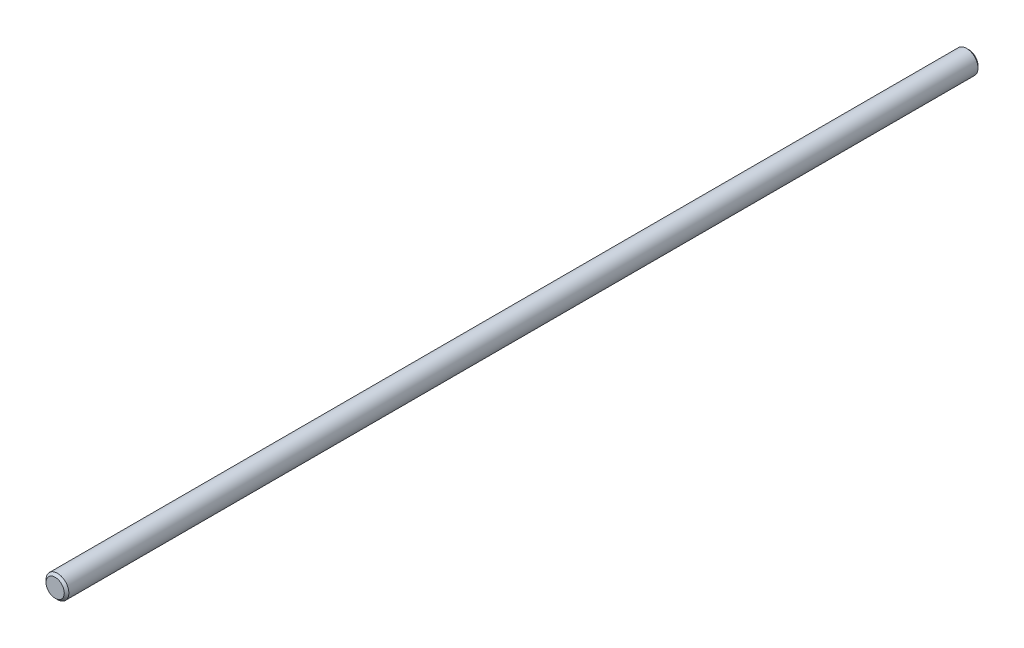
ISO-10303-21;
HEADER;
FILE_DESCRIPTION(('STEP AP214'),'2;1');
FILE_NAME('part.step','',(''),(''),'','','');
FILE_SCHEMA(('AUTOMOTIVE_DESIGN { 1 0 10303 214 1 1 1 1 }'));
ENDSEC;
DATA;
#1=APPLICATION_CONTEXT('core data for automotive mechanical design processes');
#2=APPLICATION_PROTOCOL_DEFINITION('international standard','automotive_design',2000,#1);
#3=PRODUCT_CONTEXT('',#1,'mechanical');
#4=PRODUCT('Part','Part','',(#3));
#5=PRODUCT_RELATED_PRODUCT_CATEGORY('part','',(#4));
#6=PRODUCT_DEFINITION_FORMATION('','',#4);
#7=PRODUCT_DEFINITION_CONTEXT('part definition',#1,'design');
#8=PRODUCT_DEFINITION('design','',#6,#7);
#9=PRODUCT_DEFINITION_SHAPE('','',#8);
#10=(LENGTH_UNIT() NAMED_UNIT(*) SI_UNIT(.MILLI.,.METRE.));
#11=(NAMED_UNIT(*) PLANE_ANGLE_UNIT() SI_UNIT($,.RADIAN.));
#12=(NAMED_UNIT(*) SI_UNIT($,.STERADIAN.) SOLID_ANGLE_UNIT());
#13=UNCERTAINTY_MEASURE_WITH_UNIT(LENGTH_MEASURE(1.E-05),#10,'distance_accuracy_value','');
#14=(GEOMETRIC_REPRESENTATION_CONTEXT(3) GLOBAL_UNCERTAINTY_ASSIGNED_CONTEXT((#13)) GLOBAL_UNIT_ASSIGNED_CONTEXT((#10,
#11,#12)) REPRESENTATION_CONTEXT('',''));
#15=CARTESIAN_POINT('',(0.,0.,0.));
#16=DIRECTION('',(0.,0.,1.));
#17=DIRECTION('',(1.,0.,0.));
#18=AXIS2_PLACEMENT_3D('',#15,#16,#17);
#19=CARTESIAN_POINT('',(0.,0.,190.5));
#20=DIRECTION('',(0.,0.,-1.));
#21=DIRECTION('',(-1.,0.,0.));
#22=AXIS2_PLACEMENT_3D('',#19,#20,#21);
#23=CYLINDRICAL_SURFACE('',#22,4.7625);
#24=CARTESIAN_POINT('',(0.,0.,-189.5475));
#25=DIRECTION('',(0.,0.,1.));
#26=DIRECTION('',(1.,0.,0.));
#27=AXIS2_PLACEMENT_3D('',#24,#25,#26);
#28=CIRCLE('',#27,4.7625);
#29=CARTESIAN_POINT('',(4.76249999999999,0.,-189.5475));
#30=VERTEX_POINT('',#29);
#31=EDGE_CURVE('E42',#30,#30,#28,.T.);
#32=ORIENTED_EDGE('',*,*,#31,.T.);
#33=EDGE_LOOP('',(#32));
#34=FACE_BOUND('',#33,.T.);
#35=CARTESIAN_POINT('',(0.,0.,189.5475));
#36=DIRECTION('',(0.,0.,1.));
#37=DIRECTION('',(1.,0.,0.));
#38=AXIS2_PLACEMENT_3D('',#35,#36,#37);
#39=CIRCLE('',#38,4.7625);
#40=CARTESIAN_POINT('',(4.7625,0.,189.5475));
#41=VERTEX_POINT('',#40);
#42=EDGE_CURVE('E46',#41,#41,#39,.F.);
#43=ORIENTED_EDGE('',*,*,#42,.T.);
#44=EDGE_LOOP('',(#43));
#45=FACE_BOUND('',#44,.T.);
#46=ADVANCED_FACE('F31',(#34,#45),#23,.T.);
#47=CARTESIAN_POINT('',(0.,0.,190.5));
#48=DIRECTION('',(0.,0.,1.));
#49=DIRECTION('',(1.,0.,0.));
#50=AXIS2_PLACEMENT_3D('',#47,#48,#49);
#51=PLANE('',#50);
#52=CARTESIAN_POINT('',(0.,0.,190.5));
#53=DIRECTION('',(0.,0.,1.));
#54=DIRECTION('',(1.,0.,0.));
#55=AXIS2_PLACEMENT_3D('',#52,#53,#54);
#56=CIRCLE('',#55,3.80999999999992);
#57=CARTESIAN_POINT('',(3.80999999999992,0.,190.5));
#58=VERTEX_POINT('',#57);
#59=EDGE_CURVE('E10',#58,#58,#56,.T.);
#60=ORIENTED_EDGE('',*,*,#59,.T.);
#61=EDGE_LOOP('',(#60));
#62=FACE_BOUND('',#61,.T.);
#63=ADVANCED_FACE('F62',(#62),#51,.T.);
#64=CARTESIAN_POINT('',(0.,0.,-190.5));
#65=DIRECTION('',(0.,0.,1.));
#66=DIRECTION('',(1.,0.,0.));
#67=AXIS2_PLACEMENT_3D('',#64,#65,#66);
#68=PLANE('',#67);
#69=CARTESIAN_POINT('',(0.,0.,-190.5));
#70=DIRECTION('',(0.,0.,1.));
#71=DIRECTION('',(1.,0.,0.));
#72=AXIS2_PLACEMENT_3D('',#69,#70,#71);
#73=CIRCLE('',#72,3.80999999999992);
#74=CARTESIAN_POINT('',(3.80999999999991,0.,-190.5));
#75=VERTEX_POINT('',#74);
#76=EDGE_CURVE('E38',#75,#75,#73,.F.);
#77=ORIENTED_EDGE('',*,*,#76,.T.);
#78=EDGE_LOOP('',(#77));
#79=FACE_BOUND('',#78,.T.);
#80=ADVANCED_FACE('F59',(#79),#68,.F.);
#81=CARTESIAN_POINT('',(0.,0.,-189.5475));
#82=DIRECTION('',(0.,0.,1.));
#83=DIRECTION('',(1.,0.,0.));
#84=AXIS2_PLACEMENT_3D('',#81,#82,#83);
#85=CONICAL_SURFACE('',#84,4.7625,0.785398163397447);
#86=CARTESIAN_POINT('',(3.80999999999991,0.,-190.5));
#87=CARTESIAN_POINT('',(3.81992187499991,0.,-190.490078125));
#88=CARTESIAN_POINT('',(3.82984374999991,0.,-190.48015625));
#89=CARTESIAN_POINT('',(3.84968749999991,0.,-190.4603125));
#90=CARTESIAN_POINT('',(3.85960937499992,0.,-190.450390625));
#91=CARTESIAN_POINT('',(3.87945312499992,0.,-190.430546875));
#92=CARTESIAN_POINT('',(3.88937499999991,0.,-190.420625));
#93=CARTESIAN_POINT('',(3.90921874999992,0.,-190.40078125));
#94=CARTESIAN_POINT('',(3.91914062499992,0.,-190.390859375));
#95=CARTESIAN_POINT('',(3.93898437499992,0.,-190.371015625));
#96=CARTESIAN_POINT('',(3.94890624999992,0.,-190.36109375));
#97=CARTESIAN_POINT('',(3.96874999999992,0.,-190.34125));
#98=CARTESIAN_POINT('',(3.97867187499992,0.,-190.331328125));
#99=CARTESIAN_POINT('',(3.99851562499992,0.,-190.311484375));
#100=CARTESIAN_POINT('',(4.00843749999993,0.,-190.3015625));
#101=CARTESIAN_POINT('',(4.02828124999993,0.,-190.28171875));
#102=CARTESIAN_POINT('',(4.03820312499993,0.,-190.271796875));
#103=CARTESIAN_POINT('',(4.05804687499993,0.,-190.251953125));
#104=CARTESIAN_POINT('',(4.06796874999993,0.,-190.24203125));
#105=CARTESIAN_POINT('',(4.08781249999993,0.,-190.2221875));
#106=CARTESIAN_POINT('',(4.09773437499993,0.,-190.212265625));
#107=CARTESIAN_POINT('',(4.11757812499994,0.,-190.192421875));
#108=CARTESIAN_POINT('',(4.12749999999994,0.,-190.1825));
#109=CARTESIAN_POINT('',(4.14734374999994,0.,-190.16265625));
#110=CARTESIAN_POINT('',(4.15726562499993,0.,-190.152734375));
#111=CARTESIAN_POINT('',(4.17710937499994,0.,-190.132890625));
#112=CARTESIAN_POINT('',(4.18703124999994,0.,-190.12296875));
#113=CARTESIAN_POINT('',(4.20687499999995,0.,-190.103125));
#114=CARTESIAN_POINT('',(4.21679687499994,0.,-190.093203125));
#115=CARTESIAN_POINT('',(4.23664062499994,0.,-190.073359375));
#116=CARTESIAN_POINT('',(4.24656249999994,0.,-190.0634375));
#117=CARTESIAN_POINT('',(4.26640624999995,0.,-190.04359375));
#118=CARTESIAN_POINT('',(4.27632812499995,0.,-190.033671875));
#119=CARTESIAN_POINT('',(4.29617187499995,0.,-190.013828125));
#120=CARTESIAN_POINT('',(4.30609374999995,0.,-190.00390625));
#121=CARTESIAN_POINT('',(4.32593749999995,0.,-189.9840625));
#122=CARTESIAN_POINT('',(4.33585937499995,0.,-189.974140625));
#123=CARTESIAN_POINT('',(4.35570312499995,0.,-189.954296875));
#124=CARTESIAN_POINT('',(4.36562499999995,0.,-189.944375));
#125=CARTESIAN_POINT('',(4.38546874999995,0.,-189.92453125));
#126=CARTESIAN_POINT('',(4.39539062499996,0.,-189.914609375));
#127=CARTESIAN_POINT('',(4.41523437499996,0.,-189.894765625));
#128=CARTESIAN_POINT('',(4.42515624999996,0.,-189.88484375));
#129=CARTESIAN_POINT('',(4.44499999999996,0.,-189.865));
#130=CARTESIAN_POINT('',(4.45492187499996,0.,-189.855078125));
#131=CARTESIAN_POINT('',(4.47476562499996,0.,-189.835234375));
#132=CARTESIAN_POINT('',(4.48468749999997,0.,-189.8253125));
#133=CARTESIAN_POINT('',(4.50453124999997,0.,-189.80546875));
#134=CARTESIAN_POINT('',(4.51445312499997,0.,-189.795546875));
#135=CARTESIAN_POINT('',(4.53429687499997,0.,-189.775703125));
#136=CARTESIAN_POINT('',(4.54421874999997,0.,-189.76578125));
#137=CARTESIAN_POINT('',(4.56406249999997,0.,-189.7459375));
#138=CARTESIAN_POINT('',(4.57398437499997,0.,-189.736015625));
#139=CARTESIAN_POINT('',(4.59382812499998,0.,-189.716171875));
#140=CARTESIAN_POINT('',(4.60374999999997,0.,-189.70625));
#141=CARTESIAN_POINT('',(4.62359374999997,0.,-189.68640625));
#142=CARTESIAN_POINT('',(4.63351562499997,0.,-189.676484375));
#143=CARTESIAN_POINT('',(4.65335937499998,0.,-189.656640625));
#144=CARTESIAN_POINT('',(4.66328124999998,0.,-189.64671875));
#145=CARTESIAN_POINT('',(4.68312499999998,0.,-189.626875));
#146=CARTESIAN_POINT('',(4.69304687499998,0.,-189.616953125));
#147=CARTESIAN_POINT('',(4.71289062499998,0.,-189.597109375));
#148=CARTESIAN_POINT('',(4.72281249999998,0.,-189.5871875));
#149=CARTESIAN_POINT('',(4.74265624999998,0.,-189.56734375));
#150=CARTESIAN_POINT('',(4.75257812499999,0.,-189.557421875));
#151=CARTESIAN_POINT('',(4.76249999999999,0.,-189.5475));
#152=B_SPLINE_CURVE_WITH_KNOTS('',3,(#86,#87,#88,#89,#90,#91,#92,#93,#94,#95,#96,#97,#98,#99,
#100,#101,#102,#103,#104,#105,#106,#107,#108,#109,#110,#111,#112,#113,#114,#115,#116,#117,#118,
#119,#120,#121,#122,#123,#124,#125,#126,#127,#128,#129,#130,#131,#132,#133,#134,#135,#136,#137,
#138,#139,#140,#141,#142,#143,#144,#145,#146,#147,#148,#149,#150,#151),.UNSPECIFIED.,.F.,.F.,(4,
2,2,2,2,2,2,2,2,2,2,2,2,2,2,2,2,2,2,2,2,2,2,2,2,2,2,2,2,2,2,2,4),(0.,0.0420949505675209,
0.0841899011350422,0.126284851702563,0.168379802270065,0.210474752837586,0.252569703405107,
0.294664653972609,0.33675960454013,0.378854555107651,0.420949505675152,0.463044456242674,
0.505139406810195,0.547234357377697,0.589329307945218,0.631424258512739,0.673519209080241,
0.715614159647762,0.757709110215283,0.799804060782805,0.841899011350306,0.883993961917827,
0.926088912485348,0.96818386305285,1.01027881362037,1.05237376418789,1.09446871475539,
1.13656366532292,1.17865861589044,1.22075356645794,1.26284851702546,1.30494346759298,
1.3470384181605),.UNSPECIFIED.);
#153=EDGE_CURVE('BSEAM55',#75,#30,#152,.T.);
#154=ORIENTED_EDGE('',*,*,#76,.F.);
#155=ORIENTED_EDGE('',*,*,#31,.F.);
#156=ORIENTED_EDGE('',*,*,#153,.T.);
#157=ORIENTED_EDGE('',*,*,#153,.F.);
#158=EDGE_LOOP('',(#154,#156,#155,#157));
#159=FACE_BOUND('',#158,.T.);
#160=ADVANCED_FACE('F55',(#159),#85,.T.);
#161=CARTESIAN_POINT('',(0.,0.,190.5));
#162=DIRECTION('',(0.,0.,-1.));
#163=DIRECTION('',(-1.,0.,0.));
#164=AXIS2_PLACEMENT_3D('',#161,#162,#163);
#165=CONICAL_SURFACE('',#164,3.80999999999992,0.785398163397432);
#166=ORIENTED_EDGE('',*,*,#42,.F.);
#167=EDGE_LOOP('',(#166));
#168=FACE_BOUND('',#167,.T.);
#169=ORIENTED_EDGE('',*,*,#59,.F.);
#170=EDGE_LOOP('',(#169));
#171=FACE_BOUND('',#170,.T.);
#172=ADVANCED_FACE('F33',(#168,#171),#165,.T.);
#173=CLOSED_SHELL('',(#46,#63,#80,#160,#172));
#174=MANIFOLD_SOLID_BREP('B2',#173);
#175=ADVANCED_BREP_SHAPE_REPRESENTATION('',(#18,#174),#14);
#176=SHAPE_DEFINITION_REPRESENTATION(#9,#175);
ENDSEC;
END-ISO-10303-21;
